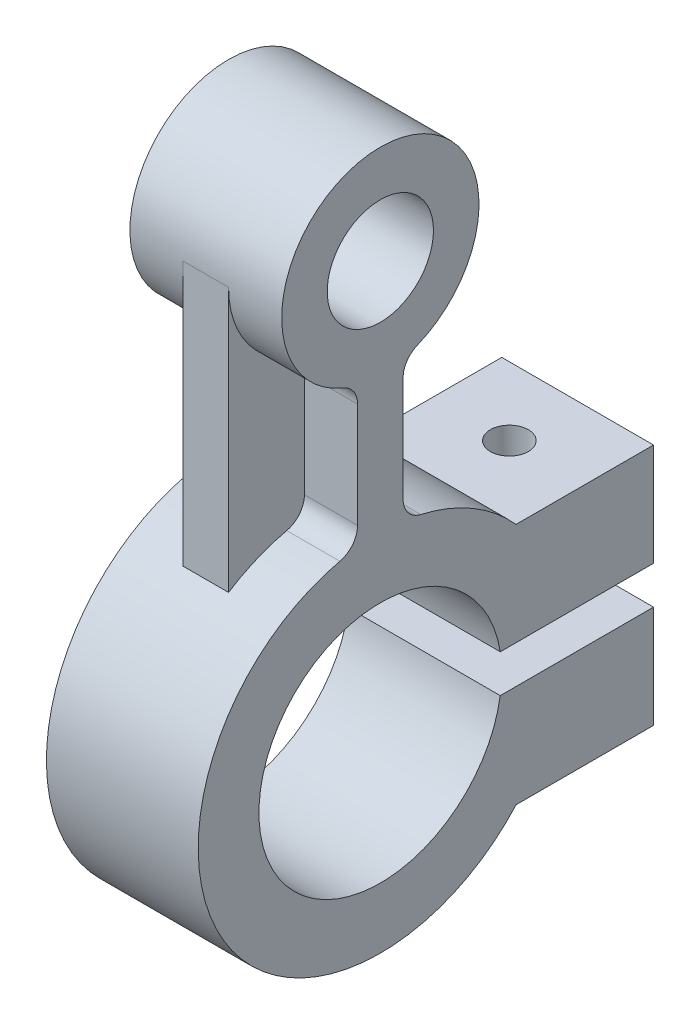
ISO-10303-21;
HEADER;
FILE_DESCRIPTION(('STEP AP214'),'2;1');
FILE_NAME('part.step','',(''),(''),'','','');
FILE_SCHEMA(('AUTOMOTIVE_DESIGN { 1 0 10303 214 1 1 1 1 }'));
ENDSEC;
DATA;
#1=APPLICATION_CONTEXT('core data for automotive mechanical design processes');
#2=APPLICATION_PROTOCOL_DEFINITION('international standard','automotive_design',2000,#1);
#3=PRODUCT_CONTEXT('',#1,'mechanical');
#4=PRODUCT('Part','Part','',(#3));
#5=PRODUCT_RELATED_PRODUCT_CATEGORY('part','',(#4));
#6=PRODUCT_DEFINITION_FORMATION('','',#4);
#7=PRODUCT_DEFINITION_CONTEXT('part definition',#1,'design');
#8=PRODUCT_DEFINITION('design','',#6,#7);
#9=PRODUCT_DEFINITION_SHAPE('','',#8);
#10=(LENGTH_UNIT() NAMED_UNIT(*) SI_UNIT(.MILLI.,.METRE.));
#11=(NAMED_UNIT(*) PLANE_ANGLE_UNIT() SI_UNIT($,.RADIAN.));
#12=(NAMED_UNIT(*) SI_UNIT($,.STERADIAN.) SOLID_ANGLE_UNIT());
#13=UNCERTAINTY_MEASURE_WITH_UNIT(LENGTH_MEASURE(1.E-05),#10,'distance_accuracy_value','');
#14=(GEOMETRIC_REPRESENTATION_CONTEXT(3) GLOBAL_UNCERTAINTY_ASSIGNED_CONTEXT((#13)) GLOBAL_UNIT_ASSIGNED_CONTEXT((#10,
#11,#12)) REPRESENTATION_CONTEXT('',''));
#15=CARTESIAN_POINT('',(0.,0.,0.));
#16=DIRECTION('',(0.,0.,1.));
#17=DIRECTION('',(1.,0.,0.));
#18=AXIS2_PLACEMENT_3D('',#15,#16,#17);
#19=CARTESIAN_POINT('',(10.,40.1676030258087,6.));
#20=DIRECTION('',(-1.,0.,0.));
#21=DIRECTION('',(0.,0.,1.));
#22=AXIS2_PLACEMENT_3D('',#19,#20,#21);
#23=CYLINDRICAL_SURFACE('',#22,3.);
#24=CARTESIAN_POINT('',(-3.,40.1676030258087,6.));
#25=DIRECTION('',(1.,0.,0.));
#26=DIRECTION('',(0.,0.,-1.));
#27=AXIS2_PLACEMENT_3D('',#24,#25,#26);
#28=CIRCLE('',#27,3.);
#29=CARTESIAN_POINT('',(-3.,42.9486774584696,4.87500000000001));
#30=VERTEX_POINT('',#29);
#31=CARTESIAN_POINT('',(-3.,40.1676030258087,3.));
#32=VERTEX_POINT('',#31);
#33=EDGE_CURVE('E212',#30,#32,#28,.F.);
#34=ORIENTED_EDGE('',*,*,#33,.F.);
#35=DIRECTION('',(-1.,0.,0.));
#36=VECTOR('',#35,1.);
#37=CARTESIAN_POINT('',(10.,42.9486774584696,4.87500000000001));
#38=LINE('',#37,#36);
#39=CARTESIAN_POINT('',(-10.,42.9486774584696,4.87500000000001));
#40=VERTEX_POINT('',#39);
#41=EDGE_CURVE('E322',#30,#40,#38,.T.);
#42=ORIENTED_EDGE('',*,*,#41,.T.);
#43=CARTESIAN_POINT('',(-10.,40.1676030258087,6.));
#44=DIRECTION('',(-1.,0.,0.));
#45=DIRECTION('',(0.,0.,-1.));
#46=AXIS2_PLACEMENT_3D('',#43,#44,#45);
#47=CIRCLE('',#46,3.);
#48=CARTESIAN_POINT('',(-10.,40.1676030258087,3.));
#49=VERTEX_POINT('',#48);
#50=EDGE_CURVE('E307',#40,#49,#47,.T.);
#51=ORIENTED_EDGE('',*,*,#50,.T.);
#52=DIRECTION('',(-1.,0.,0.));
#53=VECTOR('',#52,1.);
#54=CARTESIAN_POINT('',(10.,40.1676030258087,3.));
#55=LINE('',#54,#53);
#56=EDGE_CURVE('E318',#32,#49,#55,.T.);
#57=ORIENTED_EDGE('',*,*,#56,.F.);
#58=EDGE_LOOP('',(#34,#42,#51,#57));
#59=FACE_BOUND('',#58,.T.);
#60=ADVANCED_FACE('F39',(#59),#23,.F.);
#61=CARTESIAN_POINT('',(10.,26.3248931621764,3.));
#62=DIRECTION('',(0.,0.,-1.));
#63=DIRECTION('',(-1.,0.,0.));
#64=AXIS2_PLACEMENT_3D('',#61,#62,#63);
#65=PLANE('',#64);
#66=DIRECTION('',(0.,-1.,0.));
#67=VECTOR('',#66,1.);
#68=CARTESIAN_POINT('',(-3.,26.3248931621764,3.));
#69=LINE('',#68,#67);
#70=CARTESIAN_POINT('',(-3.,26.3248931621764,3.));
#71=VERTEX_POINT('',#70);
#72=EDGE_CURVE('E209',#32,#71,#69,.T.);
#73=ORIENTED_EDGE('',*,*,#72,.F.);
#74=ORIENTED_EDGE('',*,*,#56,.T.);
#75=DIRECTION('',(0.,-1.,0.));
#76=VECTOR('',#75,1.);
#77=CARTESIAN_POINT('',(-10.,26.3248931621764,3.));
#78=LINE('',#77,#76);
#79=CARTESIAN_POINT('',(-10.,26.3248931621764,3.));
#80=VERTEX_POINT('',#79);
#81=EDGE_CURVE('E310',#49,#80,#78,.T.);
#82=ORIENTED_EDGE('',*,*,#81,.T.);
#83=DIRECTION('',(-1.,0.,0.));
#84=VECTOR('',#83,1.);
#85=CARTESIAN_POINT('',(10.,26.3248931621764,3.));
#86=LINE('',#85,#84);
#87=EDGE_CURVE('E314',#71,#80,#86,.T.);
#88=ORIENTED_EDGE('',*,*,#87,.F.);
#89=EDGE_LOOP('',(#73,#74,#82,#88));
#90=FACE_BOUND('',#89,.T.);
#91=ADVANCED_FACE('F443',(#90),#65,.F.);
#92=CARTESIAN_POINT('',(10.,26.3248931621764,6.));
#93=DIRECTION('',(-1.,0.,0.));
#94=DIRECTION('',(0.,0.,1.));
#95=AXIS2_PLACEMENT_3D('',#92,#93,#94);
#96=CYLINDRICAL_SURFACE('',#95,3.);
#97=CARTESIAN_POINT('',(-3.,26.3248931621764,6.));
#98=DIRECTION('',(1.,0.,0.));
#99=DIRECTION('',(0.,0.,-1.));
#100=AXIS2_PLACEMENT_3D('',#97,#98,#99);
#101=CIRCLE('',#100,3.);
#102=CARTESIAN_POINT('',(-3.,23.3999050330457,5.33333333333333));
#103=VERTEX_POINT('',#102);
#104=EDGE_CURVE('E190',#71,#103,#101,.F.);
#105=ORIENTED_EDGE('',*,*,#104,.F.);
#106=ORIENTED_EDGE('',*,*,#87,.T.);
#107=CARTESIAN_POINT('',(-10.,26.3248931621764,6.));
#108=DIRECTION('',(-1.,0.,0.));
#109=DIRECTION('',(0.,0.,1.));
#110=AXIS2_PLACEMENT_3D('',#107,#108,#109);
#111=CIRCLE('',#110,3.);
#112=CARTESIAN_POINT('',(-10.,23.3999050330457,5.33333333333333));
#113=VERTEX_POINT('',#112);
#114=EDGE_CURVE('E193',#80,#113,#111,.T.);
#115=ORIENTED_EDGE('',*,*,#114,.T.);
#116=DIRECTION('',(-1.,0.,0.));
#117=VECTOR('',#116,1.);
#118=CARTESIAN_POINT('',(10.,23.3999050330457,5.33333333333333));
#119=LINE('',#118,#117);
#120=EDGE_CURVE('E187',#103,#113,#119,.T.);
#121=ORIENTED_EDGE('',*,*,#120,.F.);
#122=EDGE_LOOP('',(#105,#106,#115,#121));
#123=FACE_BOUND('',#122,.T.);
#124=ADVANCED_FACE('F188',(#123),#96,.F.);
#125=CARTESIAN_POINT('',(10.,0.,0.));
#126=DIRECTION('',(1.,0.,0.));
#127=DIRECTION('',(0.,0.,-1.));
#128=AXIS2_PLACEMENT_3D('',#125,#126,#127);
#129=PLANE('',#128);
#130=CARTESIAN_POINT('',(10.,0.,0.));
#131=DIRECTION('',(1.,0.,0.));
#132=DIRECTION('',(0.,0.,-1.));
#133=AXIS2_PLACEMENT_3D('',#130,#131,#132);
#134=CIRCLE('',#133,24.);
#135=CARTESIAN_POINT('',(10.,23.3999050330457,5.33333333333333));
#136=VERTEX_POINT('',#135);
#137=CARTESIAN_POINT('',(10.,-16.,-17.8885438199983));
#138=VERTEX_POINT('',#137);
#139=EDGE_CURVE('E238',#136,#138,#134,.T.);
#140=ORIENTED_EDGE('',*,*,#139,.T.);
#141=DIRECTION('',(0.,0.,-1.));
#142=VECTOR('',#141,1.);
#143=CARTESIAN_POINT('',(10.,-16.,-36.));
#144=LINE('',#143,#142);
#145=CARTESIAN_POINT('',(10.,-16.,-36.));
#146=VERTEX_POINT('',#145);
#147=EDGE_CURVE('E241',#138,#146,#144,.T.);
#148=ORIENTED_EDGE('',*,*,#147,.T.);
#149=DIRECTION('',(0.,1.,0.));
#150=VECTOR('',#149,1.);
#151=CARTESIAN_POINT('',(10.,-16.,-36.));
#152=LINE('',#151,#150);
#153=CARTESIAN_POINT('',(10.,-2.5,-36.));
#154=VERTEX_POINT('',#153);
#155=EDGE_CURVE('E243',#146,#154,#152,.T.);
#156=ORIENTED_EDGE('',*,*,#155,.T.);
#157=DIRECTION('',(0.,0.,1.));
#158=VECTOR('',#157,1.);
#159=CARTESIAN_POINT('',(10.,-2.50000000000001,-15.8034806292791));
#160=LINE('',#159,#158);
#161=CARTESIAN_POINT('',(10.,-2.50000000000001,-15.8034806292791));
#162=VERTEX_POINT('',#161);
#163=EDGE_CURVE('E245',#154,#162,#160,.T.);
#164=ORIENTED_EDGE('',*,*,#163,.T.);
#165=CARTESIAN_POINT('',(10.,0.,0.));
#166=DIRECTION('',(-1.,0.,0.));
#167=DIRECTION('',(0.,0.,-1.));
#168=AXIS2_PLACEMENT_3D('',#165,#166,#167);
#169=CIRCLE('',#168,16.);
#170=CARTESIAN_POINT('',(10.,2.5,-15.8034806292791));
#171=VERTEX_POINT('',#170);
#172=EDGE_CURVE('E247',#162,#171,#169,.T.);
#173=ORIENTED_EDGE('',*,*,#172,.T.);
#174=DIRECTION('',(0.,0.,-1.));
#175=VECTOR('',#174,1.);
#176=CARTESIAN_POINT('',(10.,2.5,-36.));
#177=LINE('',#176,#175);
#178=CARTESIAN_POINT('',(10.,2.5,-36.));
#179=VERTEX_POINT('',#178);
#180=EDGE_CURVE('E249',#171,#179,#177,.T.);
#181=ORIENTED_EDGE('',*,*,#180,.T.);
#182=DIRECTION('',(0.,1.,0.));
#183=VECTOR('',#182,1.);
#184=CARTESIAN_POINT('',(10.,2.5,-36.));
#185=LINE('',#184,#183);
#186=CARTESIAN_POINT('',(10.,16.,-36.));
#187=VERTEX_POINT('',#186);
#188=EDGE_CURVE('E251',#179,#187,#185,.T.);
#189=ORIENTED_EDGE('',*,*,#188,.T.);
#190=DIRECTION('',(0.,0.,1.));
#191=VECTOR('',#190,1.);
#192=CARTESIAN_POINT('',(10.,16.,-36.));
#193=LINE('',#192,#191);
#194=CARTESIAN_POINT('',(10.,16.,-17.8885438199983));
#195=VERTEX_POINT('',#194);
#196=EDGE_CURVE('E253',#187,#195,#193,.T.);
#197=ORIENTED_EDGE('',*,*,#196,.T.);
#198=CARTESIAN_POINT('',(10.,0.,0.));
#199=DIRECTION('',(1.,0.,0.));
#200=DIRECTION('',(0.,0.,-1.));
#201=AXIS2_PLACEMENT_3D('',#198,#199,#200);
#202=CIRCLE('',#201,24.);
#203=CARTESIAN_POINT('',(10.,23.3999050330457,-5.33333333333333));
#204=VERTEX_POINT('',#203);
#205=EDGE_CURVE('E255',#195,#204,#202,.T.);
#206=ORIENTED_EDGE('',*,*,#205,.T.);
#207=CARTESIAN_POINT('',(10.,26.3248931621764,-6.));
#208=DIRECTION('',(-1.,0.,0.));
#209=DIRECTION('',(0.,0.,-1.));
#210=AXIS2_PLACEMENT_3D('',#207,#208,#209);
#211=CIRCLE('',#210,3.);
#212=CARTESIAN_POINT('',(10.,26.3248931621764,-3.));
#213=VERTEX_POINT('',#212);
#214=EDGE_CURVE('E257',#204,#213,#211,.T.);
#215=ORIENTED_EDGE('',*,*,#214,.T.);
#216=DIRECTION('',(0.,1.,0.));
#217=VECTOR('',#216,1.);
#218=CARTESIAN_POINT('',(10.,26.3248931621764,-3.));
#219=LINE('',#218,#217);
#220=CARTESIAN_POINT('',(10.,40.1676030258087,-3.));
#221=VERTEX_POINT('',#220);
#222=EDGE_CURVE('E259',#213,#221,#219,.T.);
#223=ORIENTED_EDGE('',*,*,#222,.T.);
#224=CARTESIAN_POINT('',(10.,40.1676030258087,-6.));
#225=DIRECTION('',(-1.,0.,0.));
#226=DIRECTION('',(0.,0.,1.));
#227=AXIS2_PLACEMENT_3D('',#224,#225,#226);
#228=CIRCLE('',#227,3.);
#229=CARTESIAN_POINT('',(10.,42.9486774584695,-4.875));
#230=VERTEX_POINT('',#229);
#231=EDGE_CURVE('E261',#221,#230,#228,.T.);
#232=ORIENTED_EDGE('',*,*,#231,.T.);
#233=CARTESIAN_POINT('',(10.,55.,0.));
#234=DIRECTION('',(1.,0.,0.));
#235=DIRECTION('',(0.,0.,-1.));
#236=AXIS2_PLACEMENT_3D('',#233,#234,#235);
#237=CIRCLE('',#236,13.);
#238=CARTESIAN_POINT('',(10.,42.9486774584696,4.87500000000001));
#239=VERTEX_POINT('',#238);
#240=EDGE_CURVE('E263',#230,#239,#237,.T.);
#241=ORIENTED_EDGE('',*,*,#240,.T.);
#242=CARTESIAN_POINT('',(10.,40.1676030258087,6.));
#243=DIRECTION('',(-1.,0.,0.));
#244=DIRECTION('',(0.,0.,-1.));
#245=AXIS2_PLACEMENT_3D('',#242,#243,#244);
#246=CIRCLE('',#245,3.);
#247=CARTESIAN_POINT('',(10.,40.1676030258087,3.));
#248=VERTEX_POINT('',#247);
#249=EDGE_CURVE('E265',#239,#248,#246,.T.);
#250=ORIENTED_EDGE('',*,*,#249,.T.);
#251=DIRECTION('',(0.,-1.,0.));
#252=VECTOR('',#251,1.);
#253=CARTESIAN_POINT('',(10.,26.3248931621764,3.));
#254=LINE('',#253,#252);
#255=CARTESIAN_POINT('',(10.,26.3248931621764,3.));
#256=VERTEX_POINT('',#255);
#257=EDGE_CURVE('E267',#248,#256,#254,.T.);
#258=ORIENTED_EDGE('',*,*,#257,.T.);
#259=CARTESIAN_POINT('',(10.,26.3248931621764,6.));
#260=DIRECTION('',(-1.,0.,0.));
#261=DIRECTION('',(0.,0.,1.));
#262=AXIS2_PLACEMENT_3D('',#259,#260,#261);
#263=CIRCLE('',#262,3.);
#264=EDGE_CURVE('E197',#256,#136,#263,.T.);
#265=ORIENTED_EDGE('',*,*,#264,.T.);
#266=EDGE_LOOP('',(#140,#148,#156,#164,#173,#181,#189,#197,#206,#215,#223,#232,#241,#250,#258,#265));
#267=FACE_BOUND('',#266,.T.);
#268=CARTESIAN_POINT('',(10.,55.,0.));
#269=DIRECTION('',(1.,0.,0.));
#270=DIRECTION('',(0.,0.,-1.));
#271=AXIS2_PLACEMENT_3D('',#268,#269,#270);
#272=CIRCLE('',#271,7.);
#273=CARTESIAN_POINT('',(10.,55.,-7.));
#274=VERTEX_POINT('',#273);
#275=EDGE_CURVE('E232',#274,#274,#272,.T.);
#276=ORIENTED_EDGE('',*,*,#275,.F.);
#277=EDGE_LOOP('',(#276));
#278=FACE_BOUND('',#277,.T.);
#279=ADVANCED_FACE('F365',(#267,#278),#129,.T.);
#280=CARTESIAN_POINT('',(-10.,0.,0.));
#281=DIRECTION('',(1.,0.,0.));
#282=DIRECTION('',(0.,0.,-1.));
#283=AXIS2_PLACEMENT_3D('',#280,#281,#282);
#284=PLANE('',#283);
#285=CARTESIAN_POINT('',(-10.,0.,0.));
#286=DIRECTION('',(1.,0.,0.));
#287=DIRECTION('',(0.,0.,-1.));
#288=AXIS2_PLACEMENT_3D('',#285,#286,#287);
#289=CIRCLE('',#288,24.);
#290=CARTESIAN_POINT('',(-10.,-16.,-17.8885438199983));
#291=VERTEX_POINT('',#290);
#292=EDGE_CURVE('E235',#113,#291,#289,.T.);
#293=ORIENTED_EDGE('',*,*,#292,.F.);
#294=ORIENTED_EDGE('',*,*,#114,.F.);
#295=ORIENTED_EDGE('',*,*,#81,.F.);
#296=ORIENTED_EDGE('',*,*,#50,.F.);
#297=CARTESIAN_POINT('',(-10.,55.,0.));
#298=DIRECTION('',(1.,0.,0.));
#299=DIRECTION('',(0.,0.,-1.));
#300=AXIS2_PLACEMENT_3D('',#297,#298,#299);
#301=CIRCLE('',#300,13.);
#302=CARTESIAN_POINT('',(-10.,42.9486774584695,-4.875));
#303=VERTEX_POINT('',#302);
#304=EDGE_CURVE('E304',#303,#40,#301,.T.);
#305=ORIENTED_EDGE('',*,*,#304,.F.);
#306=CARTESIAN_POINT('',(-10.,40.1676030258087,-6.));
#307=DIRECTION('',(-1.,0.,0.));
#308=DIRECTION('',(0.,0.,1.));
#309=AXIS2_PLACEMENT_3D('',#306,#307,#308);
#310=CIRCLE('',#309,3.);
#311=CARTESIAN_POINT('',(-10.,40.1676030258087,-3.));
#312=VERTEX_POINT('',#311);
#313=EDGE_CURVE('E301',#312,#303,#310,.T.);
#314=ORIENTED_EDGE('',*,*,#313,.F.);
#315=DIRECTION('',(0.,1.,0.));
#316=VECTOR('',#315,1.);
#317=CARTESIAN_POINT('',(-10.,26.3248931621764,-3.));
#318=LINE('',#317,#316);
#319=CARTESIAN_POINT('',(-10.,26.3248931621764,-3.));
#320=VERTEX_POINT('',#319);
#321=EDGE_CURVE('E298',#320,#312,#318,.T.);
#322=ORIENTED_EDGE('',*,*,#321,.F.);
#323=CARTESIAN_POINT('',(-10.,26.3248931621764,-6.));
#324=DIRECTION('',(-1.,0.,0.));
#325=DIRECTION('',(0.,0.,-1.));
#326=AXIS2_PLACEMENT_3D('',#323,#324,#325);
#327=CIRCLE('',#326,3.);
#328=CARTESIAN_POINT('',(-10.,23.3999050330457,-5.33333333333333));
#329=VERTEX_POINT('',#328);
#330=EDGE_CURVE('E295',#329,#320,#327,.T.);
#331=ORIENTED_EDGE('',*,*,#330,.F.);
#332=CARTESIAN_POINT('',(-10.,0.,0.));
#333=DIRECTION('',(1.,0.,0.));
#334=DIRECTION('',(0.,0.,-1.));
#335=AXIS2_PLACEMENT_3D('',#332,#333,#334);
#336=CIRCLE('',#335,24.);
#337=CARTESIAN_POINT('',(-10.,16.,-17.8885438199983));
#338=VERTEX_POINT('',#337);
#339=EDGE_CURVE('E292',#338,#329,#336,.T.);
#340=ORIENTED_EDGE('',*,*,#339,.F.);
#341=DIRECTION('',(0.,0.,1.));
#342=VECTOR('',#341,1.);
#343=CARTESIAN_POINT('',(-10.,16.,-36.));
#344=LINE('',#343,#342);
#345=CARTESIAN_POINT('',(-10.,16.,-36.));
#346=VERTEX_POINT('',#345);
#347=EDGE_CURVE('E289',#346,#338,#344,.T.);
#348=ORIENTED_EDGE('',*,*,#347,.F.);
#349=DIRECTION('',(0.,1.,0.));
#350=VECTOR('',#349,1.);
#351=CARTESIAN_POINT('',(-10.,2.5,-36.));
#352=LINE('',#351,#350);
#353=CARTESIAN_POINT('',(-10.,2.5,-36.));
#354=VERTEX_POINT('',#353);
#355=EDGE_CURVE('E286',#354,#346,#352,.T.);
#356=ORIENTED_EDGE('',*,*,#355,.F.);
#357=DIRECTION('',(0.,0.,-1.));
#358=VECTOR('',#357,1.);
#359=CARTESIAN_POINT('',(-10.,2.5,-36.));
#360=LINE('',#359,#358);
#361=CARTESIAN_POINT('',(-10.,2.5,-15.8034806292791));
#362=VERTEX_POINT('',#361);
#363=EDGE_CURVE('E283',#362,#354,#360,.T.);
#364=ORIENTED_EDGE('',*,*,#363,.F.);
#365=CARTESIAN_POINT('',(-10.,0.,0.));
#366=DIRECTION('',(-1.,0.,0.));
#367=DIRECTION('',(0.,0.,-1.));
#368=AXIS2_PLACEMENT_3D('',#365,#366,#367);
#369=CIRCLE('',#368,16.);
#370=CARTESIAN_POINT('',(-10.,-2.50000000000001,-15.8034806292791));
#371=VERTEX_POINT('',#370);
#372=EDGE_CURVE('E280',#371,#362,#369,.T.);
#373=ORIENTED_EDGE('',*,*,#372,.F.);
#374=DIRECTION('',(0.,0.,1.));
#375=VECTOR('',#374,1.);
#376=CARTESIAN_POINT('',(-10.,-2.50000000000001,-15.8034806292791));
#377=LINE('',#376,#375);
#378=CARTESIAN_POINT('',(-10.,-2.5,-36.));
#379=VERTEX_POINT('',#378);
#380=EDGE_CURVE('E277',#379,#371,#377,.T.);
#381=ORIENTED_EDGE('',*,*,#380,.F.);
#382=DIRECTION('',(0.,1.,0.));
#383=VECTOR('',#382,1.);
#384=CARTESIAN_POINT('',(-10.,-16.,-36.));
#385=LINE('',#384,#383);
#386=CARTESIAN_POINT('',(-10.,-16.,-36.));
#387=VERTEX_POINT('',#386);
#388=EDGE_CURVE('E274',#387,#379,#385,.T.);
#389=ORIENTED_EDGE('',*,*,#388,.F.);
#390=DIRECTION('',(0.,0.,-1.));
#391=VECTOR('',#390,1.);
#392=CARTESIAN_POINT('',(-10.,-16.,-36.));
#393=LINE('',#392,#391);
#394=EDGE_CURVE('E271',#291,#387,#393,.T.);
#395=ORIENTED_EDGE('',*,*,#394,.F.);
#396=EDGE_LOOP('',(#293,#294,#295,#296,#305,#314,#322,#331,#340,#348,#356,#364,#373,#381,#389,#395));
#397=FACE_BOUND('',#396,.T.);
#398=CARTESIAN_POINT('',(-10.,55.,0.));
#399=DIRECTION('',(1.,0.,0.));
#400=DIRECTION('',(0.,0.,-1.));
#401=AXIS2_PLACEMENT_3D('',#398,#399,#400);
#402=CIRCLE('',#401,7.);
#403=CARTESIAN_POINT('',(-10.,55.,-7.));
#404=VERTEX_POINT('',#403);
#405=EDGE_CURVE('E231',#404,#404,#402,.T.);
#406=ORIENTED_EDGE('',*,*,#405,.T.);
#407=EDGE_LOOP('',(#406));
#408=FACE_BOUND('',#407,.T.);
#409=ADVANCED_FACE('F355',(#397,#408),#284,.F.);
#410=CARTESIAN_POINT('',(10.,0.,0.));
#411=DIRECTION('',(-1.,0.,0.));
#412=DIRECTION('',(0.,0.,1.));
#413=AXIS2_PLACEMENT_3D('',#410,#411,#412);
#414=CYLINDRICAL_SURFACE('',#413,24.);
#415=ORIENTED_EDGE('',*,*,#292,.T.);
#416=DIRECTION('',(-1.,0.,0.));
#417=VECTOR('',#416,1.);
#418=CARTESIAN_POINT('',(10.,-16.,-17.8885438199983));
#419=LINE('',#418,#417);
#420=EDGE_CURVE('E47',#138,#291,#419,.T.);
#421=ORIENTED_EDGE('',*,*,#420,.F.);
#422=ORIENTED_EDGE('',*,*,#139,.F.);
#423=CARTESIAN_POINT('',(3.,23.3999050330457,5.33333333333333));
#424=VERTEX_POINT('',#423);
#425=EDGE_CURVE('E196',#136,#424,#119,.T.);
#426=ORIENTED_EDGE('',*,*,#425,.T.);
#427=CARTESIAN_POINT('',(3.,0.,0.));
#428=DIRECTION('',(1.,0.,0.));
#429=DIRECTION('',(0.,0.,-1.));
#430=AXIS2_PLACEMENT_3D('',#427,#428,#429);
#431=CIRCLE('',#430,24.);
#432=CARTESIAN_POINT('',(3.,20.174241001832,13.));
#433=VERTEX_POINT('',#432);
#434=EDGE_CURVE('E54',#424,#433,#431,.T.);
#435=ORIENTED_EDGE('',*,*,#434,.T.);
#436=DIRECTION('',(-1.,0.,0.));
#437=VECTOR('',#436,1.);
#438=CARTESIAN_POINT('',(10.,20.174241001832,13.));
#439=LINE('',#438,#437);
#440=CARTESIAN_POINT('',(-3.,20.174241001832,13.));
#441=VERTEX_POINT('',#440);
#442=EDGE_CURVE('E58',#433,#441,#439,.T.);
#443=ORIENTED_EDGE('',*,*,#442,.T.);
#444=CARTESIAN_POINT('',(-3.,0.,0.));
#445=DIRECTION('',(1.,0.,0.));
#446=DIRECTION('',(0.,0.,-1.));
#447=AXIS2_PLACEMENT_3D('',#444,#445,#446);
#448=CIRCLE('',#447,24.);
#449=EDGE_CURVE('E199',#103,#441,#448,.T.);
#450=ORIENTED_EDGE('',*,*,#449,.F.);
#451=ORIENTED_EDGE('',*,*,#120,.T.);
#452=EDGE_LOOP('',(#415,#421,#422,#426,#435,#443,#450,#451));
#453=FACE_BOUND('',#452,.T.);
#454=ADVANCED_FACE('F41',(#453),#414,.T.);
#455=CARTESIAN_POINT('',(10.,-16.,-36.));
#456=DIRECTION('',(0.,1.,0.));
#457=DIRECTION('',(0.,0.,1.));
#458=AXIS2_PLACEMENT_3D('',#455,#456,#457);
#459=PLANE('',#458);
#460=CARTESIAN_POINT('',(0.,-16.,-27.));
#461=DIRECTION('',(0.,1.,0.));
#462=DIRECTION('',(0.,0.,1.));
#463=AXIS2_PLACEMENT_3D('',#460,#461,#462);
#464=CIRCLE('',#463,2.5);
#465=CARTESIAN_POINT('',(0.,-16.,-24.5));
#466=VERTEX_POINT('',#465);
#467=EDGE_CURVE('E380',#466,#466,#464,.T.);
#468=ORIENTED_EDGE('',*,*,#467,.T.);
#469=EDGE_LOOP('',(#468));
#470=FACE_BOUND('',#469,.T.);
#471=ORIENTED_EDGE('',*,*,#420,.T.);
#472=ORIENTED_EDGE('',*,*,#394,.T.);
#473=DIRECTION('',(-1.,0.,0.));
#474=VECTOR('',#473,1.);
#475=CARTESIAN_POINT('',(10.,-16.,-36.));
#476=LINE('',#475,#474);
#477=EDGE_CURVE('E346',#146,#387,#476,.T.);
#478=ORIENTED_EDGE('',*,*,#477,.F.);
#479=ORIENTED_EDGE('',*,*,#147,.F.);
#480=EDGE_LOOP('',(#471,#472,#478,#479));
#481=FACE_BOUND('',#480,.T.);
#482=ADVANCED_FACE('F350',(#470,#481),#459,.F.);
#483=CARTESIAN_POINT('',(10.,-16.,-36.));
#484=DIRECTION('',(0.,0.,1.));
#485=DIRECTION('',(1.,0.,0.));
#486=AXIS2_PLACEMENT_3D('',#483,#484,#485);
#487=PLANE('',#486);
#488=ORIENTED_EDGE('',*,*,#477,.T.);
#489=ORIENTED_EDGE('',*,*,#388,.T.);
#490=DIRECTION('',(-1.,0.,0.));
#491=VECTOR('',#490,1.);
#492=CARTESIAN_POINT('',(10.,-2.5,-36.));
#493=LINE('',#492,#491);
#494=EDGE_CURVE('E344',#154,#379,#493,.T.);
#495=ORIENTED_EDGE('',*,*,#494,.F.);
#496=ORIENTED_EDGE('',*,*,#155,.F.);
#497=EDGE_LOOP('',(#488,#489,#495,#496));
#498=FACE_BOUND('',#497,.T.);
#499=ADVANCED_FACE('F361',(#498),#487,.F.);
#500=CARTESIAN_POINT('',(10.,-2.50000000000001,-15.8034806292791));
#501=DIRECTION('',(0.,-1.,0.));
#502=DIRECTION('',(0.,0.,-1.));
#503=AXIS2_PLACEMENT_3D('',#500,#501,#502);
#504=PLANE('',#503);
#505=CARTESIAN_POINT('',(0.,-2.5,-27.));
#506=DIRECTION('',(0.,-1.,0.));
#507=DIRECTION('',(0.,0.,-1.));
#508=AXIS2_PLACEMENT_3D('',#505,#506,#507);
#509=CIRCLE('',#508,2.5);
#510=CARTESIAN_POINT('',(0.,-2.5,-29.5));
#511=VERTEX_POINT('',#510);
#512=EDGE_CURVE('E382',#511,#511,#509,.T.);
#513=ORIENTED_EDGE('',*,*,#512,.T.);
#514=EDGE_LOOP('',(#513));
#515=FACE_BOUND('',#514,.T.);
#516=ORIENTED_EDGE('',*,*,#494,.T.);
#517=ORIENTED_EDGE('',*,*,#380,.T.);
#518=DIRECTION('',(-1.,0.,0.));
#519=VECTOR('',#518,1.);
#520=CARTESIAN_POINT('',(10.,-2.50000000000001,-15.8034806292791));
#521=LINE('',#520,#519);
#522=EDGE_CURVE('E342',#162,#371,#521,.T.);
#523=ORIENTED_EDGE('',*,*,#522,.F.);
#524=ORIENTED_EDGE('',*,*,#163,.F.);
#525=EDGE_LOOP('',(#516,#517,#523,#524));
#526=FACE_BOUND('',#525,.T.);
#527=ADVANCED_FACE('F430',(#515,#526),#504,.F.);
#528=CARTESIAN_POINT('',(10.,0.,0.));
#529=DIRECTION('',(-1.,0.,0.));
#530=DIRECTION('',(0.,0.,1.));
#531=AXIS2_PLACEMENT_3D('',#528,#529,#530);
#532=CYLINDRICAL_SURFACE('',#531,16.);
#533=ORIENTED_EDGE('',*,*,#372,.T.);
#534=DIRECTION('',(-1.,0.,0.));
#535=VECTOR('',#534,1.);
#536=CARTESIAN_POINT('',(10.,2.5,-15.8034806292791));
#537=LINE('',#536,#535);
#538=EDGE_CURVE('E340',#171,#362,#537,.T.);
#539=ORIENTED_EDGE('',*,*,#538,.F.);
#540=ORIENTED_EDGE('',*,*,#172,.F.);
#541=ORIENTED_EDGE('',*,*,#522,.T.);
#542=EDGE_LOOP('',(#533,#539,#540,#541));
#543=FACE_BOUND('',#542,.T.);
#544=ADVANCED_FACE('F428',(#543),#532,.F.);
#545=CARTESIAN_POINT('',(10.,2.5,-36.));
#546=DIRECTION('',(0.,1.,0.));
#547=DIRECTION('',(0.,0.,1.));
#548=AXIS2_PLACEMENT_3D('',#545,#546,#547);
#549=PLANE('',#548);
#550=CARTESIAN_POINT('',(0.,2.5,-27.));
#551=DIRECTION('',(0.,1.,0.));
#552=DIRECTION('',(0.,0.,1.));
#553=AXIS2_PLACEMENT_3D('',#550,#551,#552);
#554=CIRCLE('',#553,2.5);
#555=CARTESIAN_POINT('',(0.,2.5,-24.5));
#556=VERTEX_POINT('',#555);
#557=EDGE_CURVE('E387',#556,#556,#554,.T.);
#558=ORIENTED_EDGE('',*,*,#557,.T.);
#559=EDGE_LOOP('',(#558));
#560=FACE_BOUND('',#559,.T.);
#561=ORIENTED_EDGE('',*,*,#538,.T.);
#562=ORIENTED_EDGE('',*,*,#363,.T.);
#563=DIRECTION('',(-1.,0.,0.));
#564=VECTOR('',#563,1.);
#565=CARTESIAN_POINT('',(10.,2.5,-36.));
#566=LINE('',#565,#564);
#567=EDGE_CURVE('E338',#179,#354,#566,.T.);
#568=ORIENTED_EDGE('',*,*,#567,.F.);
#569=ORIENTED_EDGE('',*,*,#180,.F.);
#570=EDGE_LOOP('',(#561,#562,#568,#569));
#571=FACE_BOUND('',#570,.T.);
#572=ADVANCED_FACE('F426',(#560,#571),#549,.F.);
#573=CARTESIAN_POINT('',(10.,2.5,-36.));
#574=DIRECTION('',(0.,0.,1.));
#575=DIRECTION('',(1.,0.,0.));
#576=AXIS2_PLACEMENT_3D('',#573,#574,#575);
#577=PLANE('',#576);
#578=ORIENTED_EDGE('',*,*,#567,.T.);
#579=ORIENTED_EDGE('',*,*,#355,.T.);
#580=DIRECTION('',(-1.,0.,0.));
#581=VECTOR('',#580,1.);
#582=CARTESIAN_POINT('',(10.,16.,-36.));
#583=LINE('',#582,#581);
#584=EDGE_CURVE('E336',#187,#346,#583,.T.);
#585=ORIENTED_EDGE('',*,*,#584,.F.);
#586=ORIENTED_EDGE('',*,*,#188,.F.);
#587=EDGE_LOOP('',(#578,#579,#585,#586));
#588=FACE_BOUND('',#587,.T.);
#589=ADVANCED_FACE('F403',(#588),#577,.F.);
#590=CARTESIAN_POINT('',(10.,16.,-36.));
#591=DIRECTION('',(0.,-1.,0.));
#592=DIRECTION('',(0.,0.,-1.));
#593=AXIS2_PLACEMENT_3D('',#590,#591,#592);
#594=PLANE('',#593);
#595=CARTESIAN_POINT('',(0.,16.,-27.));
#596=DIRECTION('',(0.,1.,0.));
#597=DIRECTION('',(0.,0.,1.));
#598=AXIS2_PLACEMENT_3D('',#595,#596,#597);
#599=CIRCLE('',#598,2.5);
#600=CARTESIAN_POINT('',(0.,16.,-24.5));
#601=VERTEX_POINT('',#600);
#602=EDGE_CURVE('E392',#601,#601,#599,.T.);
#603=ORIENTED_EDGE('',*,*,#602,.F.);
#604=EDGE_LOOP('',(#603));
#605=FACE_BOUND('',#604,.T.);
#606=ORIENTED_EDGE('',*,*,#584,.T.);
#607=ORIENTED_EDGE('',*,*,#347,.T.);
#608=DIRECTION('',(-1.,0.,0.));
#609=VECTOR('',#608,1.);
#610=CARTESIAN_POINT('',(10.,16.,-17.8885438199983));
#611=LINE('',#610,#609);
#612=EDGE_CURVE('E334',#195,#338,#611,.T.);
#613=ORIENTED_EDGE('',*,*,#612,.F.);
#614=ORIENTED_EDGE('',*,*,#196,.F.);
#615=EDGE_LOOP('',(#606,#607,#613,#614));
#616=FACE_BOUND('',#615,.T.);
#617=ADVANCED_FACE('F399',(#605,#616),#594,.F.);
#618=CARTESIAN_POINT('',(10.,0.,0.));
#619=DIRECTION('',(-1.,0.,0.));
#620=DIRECTION('',(0.,0.,1.));
#621=AXIS2_PLACEMENT_3D('',#618,#619,#620);
#622=CYLINDRICAL_SURFACE('',#621,24.);
#623=ORIENTED_EDGE('',*,*,#612,.T.);
#624=ORIENTED_EDGE('',*,*,#339,.T.);
#625=DIRECTION('',(-1.,0.,0.));
#626=VECTOR('',#625,1.);
#627=CARTESIAN_POINT('',(10.,23.3999050330457,-5.33333333333333));
#628=LINE('',#627,#626);
#629=EDGE_CURVE('E332',#204,#329,#628,.T.);
#630=ORIENTED_EDGE('',*,*,#629,.F.);
#631=ORIENTED_EDGE('',*,*,#205,.F.);
#632=EDGE_LOOP('',(#623,#624,#630,#631));
#633=FACE_BOUND('',#632,.T.);
#634=ADVANCED_FACE('F402',(#633),#622,.T.);
#635=CARTESIAN_POINT('',(10.,26.3248931621764,-6.));
#636=DIRECTION('',(-1.,0.,0.));
#637=DIRECTION('',(0.,0.,1.));
#638=AXIS2_PLACEMENT_3D('',#635,#636,#637);
#639=CYLINDRICAL_SURFACE('',#638,3.);
#640=ORIENTED_EDGE('',*,*,#629,.T.);
#641=ORIENTED_EDGE('',*,*,#330,.T.);
#642=DIRECTION('',(-1.,0.,0.));
#643=VECTOR('',#642,1.);
#644=CARTESIAN_POINT('',(10.,26.3248931621764,-3.));
#645=LINE('',#644,#643);
#646=EDGE_CURVE('E330',#213,#320,#645,.T.);
#647=ORIENTED_EDGE('',*,*,#646,.F.);
#648=ORIENTED_EDGE('',*,*,#214,.F.);
#649=EDGE_LOOP('',(#640,#641,#647,#648));
#650=FACE_BOUND('',#649,.T.);
#651=ADVANCED_FACE('F540',(#650),#639,.F.);
#652=CARTESIAN_POINT('',(10.,26.3248931621764,-3.));
#653=DIRECTION('',(0.,0.,1.));
#654=DIRECTION('',(1.,0.,0.));
#655=AXIS2_PLACEMENT_3D('',#652,#653,#654);
#656=PLANE('',#655);
#657=ORIENTED_EDGE('',*,*,#646,.T.);
#658=ORIENTED_EDGE('',*,*,#321,.T.);
#659=DIRECTION('',(-1.,0.,0.));
#660=VECTOR('',#659,1.);
#661=CARTESIAN_POINT('',(10.,40.1676030258087,-3.));
#662=LINE('',#661,#660);
#663=EDGE_CURVE('E328',#221,#312,#662,.T.);
#664=ORIENTED_EDGE('',*,*,#663,.F.);
#665=ORIENTED_EDGE('',*,*,#222,.F.);
#666=EDGE_LOOP('',(#657,#658,#664,#665));
#667=FACE_BOUND('',#666,.T.);
#668=ADVANCED_FACE('F548',(#667),#656,.F.);
#669=CARTESIAN_POINT('',(10.,40.1676030258087,-6.));
#670=DIRECTION('',(-1.,0.,0.));
#671=DIRECTION('',(0.,0.,1.));
#672=AXIS2_PLACEMENT_3D('',#669,#670,#671);
#673=CYLINDRICAL_SURFACE('',#672,3.);
#674=ORIENTED_EDGE('',*,*,#663,.T.);
#675=ORIENTED_EDGE('',*,*,#313,.T.);
#676=DIRECTION('',(-1.,0.,0.));
#677=VECTOR('',#676,1.);
#678=CARTESIAN_POINT('',(10.,42.9486774584695,-4.875));
#679=LINE('',#678,#677);
#680=EDGE_CURVE('E326',#230,#303,#679,.T.);
#681=ORIENTED_EDGE('',*,*,#680,.F.);
#682=ORIENTED_EDGE('',*,*,#231,.F.);
#683=EDGE_LOOP('',(#674,#675,#681,#682));
#684=FACE_BOUND('',#683,.T.);
#685=ADVANCED_FACE('F464',(#684),#673,.F.);
#686=CARTESIAN_POINT('',(10.,55.,0.));
#687=DIRECTION('',(-1.,0.,0.));
#688=DIRECTION('',(0.,0.,1.));
#689=AXIS2_PLACEMENT_3D('',#686,#687,#688);
#690=CYLINDRICAL_SURFACE('',#689,13.);
#691=ORIENTED_EDGE('',*,*,#680,.T.);
#692=ORIENTED_EDGE('',*,*,#304,.T.);
#693=ORIENTED_EDGE('',*,*,#41,.F.);
#694=CARTESIAN_POINT('',(-3.,55.,0.));
#695=DIRECTION('',(1.,0.,0.));
#696=DIRECTION('',(0.,0.,-1.));
#697=AXIS2_PLACEMENT_3D('',#694,#695,#696);
#698=CIRCLE('',#697,13.);
#699=CARTESIAN_POINT('',(-3.,55.,13.));
#700=VERTEX_POINT('',#699);
#701=EDGE_CURVE('E204',#700,#30,#698,.T.);
#702=ORIENTED_EDGE('',*,*,#701,.F.);
#703=DIRECTION('',(-1.,0.,0.));
#704=VECTOR('',#703,1.);
#705=CARTESIAN_POINT('',(10.,55.,13.));
#706=LINE('',#705,#704);
#707=CARTESIAN_POINT('',(3.,55.,13.));
#708=VERTEX_POINT('',#707);
#709=EDGE_CURVE('E11',#708,#700,#706,.T.);
#710=ORIENTED_EDGE('',*,*,#709,.F.);
#711=CARTESIAN_POINT('',(3.,55.,0.));
#712=DIRECTION('',(1.,0.,0.));
#713=DIRECTION('',(0.,0.,-1.));
#714=AXIS2_PLACEMENT_3D('',#711,#712,#713);
#715=CIRCLE('',#714,13.);
#716=CARTESIAN_POINT('',(3.,42.9486774584696,4.87500000000001));
#717=VERTEX_POINT('',#716);
#718=EDGE_CURVE('E227',#708,#717,#715,.T.);
#719=ORIENTED_EDGE('',*,*,#718,.T.);
#720=EDGE_CURVE('E323',#239,#717,#38,.T.);
#721=ORIENTED_EDGE('',*,*,#720,.F.);
#722=ORIENTED_EDGE('',*,*,#240,.F.);
#723=EDGE_LOOP('',(#691,#692,#693,#702,#710,#719,#721,#722));
#724=FACE_BOUND('',#723,.T.);
#725=ADVANCED_FACE('F456',(#724),#690,.T.);
#726=ORIENTED_EDGE('',*,*,#720,.T.);
#727=CARTESIAN_POINT('',(3.,40.1676030258087,6.));
#728=DIRECTION('',(1.,0.,0.));
#729=DIRECTION('',(0.,0.,-1.));
#730=AXIS2_PLACEMENT_3D('',#727,#728,#729);
#731=CIRCLE('',#730,3.);
#732=CARTESIAN_POINT('',(3.,40.1676030258087,3.));
#733=VERTEX_POINT('',#732);
#734=EDGE_CURVE('E225',#717,#733,#731,.F.);
#735=ORIENTED_EDGE('',*,*,#734,.T.);
#736=EDGE_CURVE('E319',#248,#733,#55,.T.);
#737=ORIENTED_EDGE('',*,*,#736,.F.);
#738=ORIENTED_EDGE('',*,*,#249,.F.);
#739=EDGE_LOOP('',(#726,#735,#737,#738));
#740=FACE_BOUND('',#739,.T.);
#741=ADVANCED_FACE('F446',(#740),#23,.F.);
#742=ORIENTED_EDGE('',*,*,#736,.T.);
#743=DIRECTION('',(0.,-1.,0.));
#744=VECTOR('',#743,1.);
#745=CARTESIAN_POINT('',(3.,26.3248931621764,3.));
#746=LINE('',#745,#744);
#747=CARTESIAN_POINT('',(3.,26.3248931621764,3.));
#748=VERTEX_POINT('',#747);
#749=EDGE_CURVE('E223',#733,#748,#746,.T.);
#750=ORIENTED_EDGE('',*,*,#749,.T.);
#751=EDGE_CURVE('E315',#256,#748,#86,.T.);
#752=ORIENTED_EDGE('',*,*,#751,.F.);
#753=ORIENTED_EDGE('',*,*,#257,.F.);
#754=EDGE_LOOP('',(#742,#750,#752,#753));
#755=FACE_BOUND('',#754,.T.);
#756=ADVANCED_FACE('F453',(#755),#65,.F.);
#757=ORIENTED_EDGE('',*,*,#751,.T.);
#758=CARTESIAN_POINT('',(3.,26.3248931621764,6.));
#759=DIRECTION('',(1.,0.,0.));
#760=DIRECTION('',(0.,0.,-1.));
#761=AXIS2_PLACEMENT_3D('',#758,#759,#760);
#762=CIRCLE('',#761,3.);
#763=EDGE_CURVE('E203',#748,#424,#762,.F.);
#764=ORIENTED_EDGE('',*,*,#763,.T.);
#765=ORIENTED_EDGE('',*,*,#425,.F.);
#766=ORIENTED_EDGE('',*,*,#264,.F.);
#767=EDGE_LOOP('',(#757,#764,#765,#766));
#768=FACE_BOUND('',#767,.T.);
#769=ADVANCED_FACE('F462',(#768),#96,.F.);
#770=CARTESIAN_POINT('',(10.,55.,0.));
#771=DIRECTION('',(-1.,0.,0.));
#772=DIRECTION('',(0.,0.,1.));
#773=AXIS2_PLACEMENT_3D('',#770,#771,#772);
#774=CYLINDRICAL_SURFACE('',#773,7.);
#775=ORIENTED_EDGE('',*,*,#275,.T.);
#776=EDGE_LOOP('',(#775));
#777=FACE_BOUND('',#776,.T.);
#778=ORIENTED_EDGE('',*,*,#405,.F.);
#779=EDGE_LOOP('',(#778));
#780=FACE_BOUND('',#779,.T.);
#781=ADVANCED_FACE('F473',(#777,#780),#774,.F.);
#782=CARTESIAN_POINT('',(0.,55.,13.));
#783=DIRECTION('',(0.,0.,1.));
#784=DIRECTION('',(0.,-1.,0.));
#785=AXIS2_PLACEMENT_3D('',#782,#783,#784);
#786=PLANE('',#785);
#787=ORIENTED_EDGE('',*,*,#442,.F.);
#788=DIRECTION('',(0.,1.,0.));
#789=VECTOR('',#788,1.);
#790=CARTESIAN_POINT('',(3.,22.,13.));
#791=LINE('',#790,#789);
#792=EDGE_CURVE('E210',#708,#433,#791,.F.);
#793=ORIENTED_EDGE('',*,*,#792,.F.);
#794=ORIENTED_EDGE('',*,*,#709,.T.);
#795=DIRECTION('',(0.,1.,0.));
#796=VECTOR('',#795,1.);
#797=CARTESIAN_POINT('',(-3.,22.,13.));
#798=LINE('',#797,#796);
#799=EDGE_CURVE('E215',#700,#441,#798,.F.);
#800=ORIENTED_EDGE('',*,*,#799,.T.);
#801=EDGE_LOOP('',(#787,#793,#794,#800));
#802=FACE_BOUND('',#801,.T.);
#803=ADVANCED_FACE('F379',(#802),#786,.T.);
#804=CARTESIAN_POINT('',(3.,22.,-6.));
#805=DIRECTION('',(1.,0.,0.));
#806=DIRECTION('',(0.,0.,-1.));
#807=AXIS2_PLACEMENT_3D('',#804,#805,#806);
#808=PLANE('',#807);
#809=ORIENTED_EDGE('',*,*,#434,.F.);
#810=ORIENTED_EDGE('',*,*,#763,.F.);
#811=ORIENTED_EDGE('',*,*,#749,.F.);
#812=ORIENTED_EDGE('',*,*,#734,.F.);
#813=ORIENTED_EDGE('',*,*,#718,.F.);
#814=ORIENTED_EDGE('',*,*,#792,.T.);
#815=EDGE_LOOP('',(#809,#810,#811,#812,#813,#814));
#816=FACE_BOUND('',#815,.T.);
#817=ADVANCED_FACE('F373',(#816),#808,.T.);
#818=CARTESIAN_POINT('',(-3.,22.,-6.));
#819=DIRECTION('',(1.,0.,0.));
#820=DIRECTION('',(0.,0.,-1.));
#821=AXIS2_PLACEMENT_3D('',#818,#819,#820);
#822=PLANE('',#821);
#823=ORIENTED_EDGE('',*,*,#104,.T.);
#824=ORIENTED_EDGE('',*,*,#449,.T.);
#825=ORIENTED_EDGE('',*,*,#799,.F.);
#826=ORIENTED_EDGE('',*,*,#701,.T.);
#827=ORIENTED_EDGE('',*,*,#33,.T.);
#828=ORIENTED_EDGE('',*,*,#72,.T.);
#829=EDGE_LOOP('',(#823,#824,#825,#826,#827,#828));
#830=FACE_BOUND('',#829,.T.);
#831=ADVANCED_FACE('F207',(#830),#822,.F.);
#832=CARTESIAN_POINT('',(0.,-24.,-27.));
#833=DIRECTION('',(0.,1.,0.));
#834=DIRECTION('',(0.,0.,1.));
#835=AXIS2_PLACEMENT_3D('',#832,#833,#834);
#836=CYLINDRICAL_SURFACE('',#835,2.5);
#837=ORIENTED_EDGE('',*,*,#602,.T.);
#838=EDGE_LOOP('',(#837));
#839=FACE_BOUND('',#838,.T.);
#840=ORIENTED_EDGE('',*,*,#557,.F.);
#841=EDGE_LOOP('',(#840));
#842=FACE_BOUND('',#841,.T.);
#843=ADVANCED_FACE('F396',(#839,#842),#836,.F.);
#844=ORIENTED_EDGE('',*,*,#512,.F.);
#845=EDGE_LOOP('',(#844));
#846=FACE_BOUND('',#845,.T.);
#847=ORIENTED_EDGE('',*,*,#467,.F.);
#848=EDGE_LOOP('',(#847));
#849=FACE_BOUND('',#848,.T.);
#850=ADVANCED_FACE('F496',(#846,#849),#836,.F.);
#851=CLOSED_SHELL('',(#60,#91,#124,#279,#409,#454,#482,#499,#527,#544,#572,#589,#617,#634,#651,
#668,#685,#725,#741,#756,#769,#781,#803,#817,#831,#843,#850));
#852=MANIFOLD_SOLID_BREP('B2',#851);
#853=ADVANCED_BREP_SHAPE_REPRESENTATION('',(#18,#852),#14);
#854=SHAPE_DEFINITION_REPRESENTATION(#9,#853);
ENDSEC;
END-ISO-10303-21;
